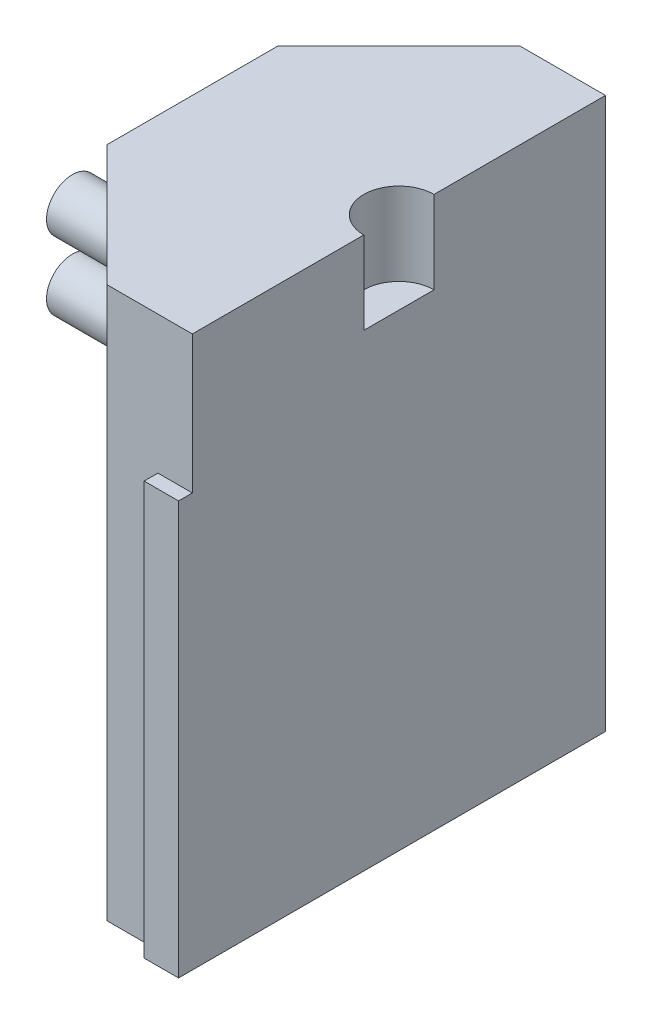
ISO-10303-21;
HEADER;
FILE_DESCRIPTION(('STEP AP214'),'2;1');
FILE_NAME('part.step','',(''),(''),'','','');
FILE_SCHEMA(('AUTOMOTIVE_DESIGN { 1 0 10303 214 1 1 1 1 }'));
ENDSEC;
DATA;
#1=APPLICATION_CONTEXT('core data for automotive mechanical design processes');
#2=APPLICATION_PROTOCOL_DEFINITION('international standard','automotive_design',2000,#1);
#3=PRODUCT_CONTEXT('',#1,'mechanical');
#4=PRODUCT('Part','Part','',(#3));
#5=PRODUCT_RELATED_PRODUCT_CATEGORY('part','',(#4));
#6=PRODUCT_DEFINITION_FORMATION('','',#4);
#7=PRODUCT_DEFINITION_CONTEXT('part definition',#1,'design');
#8=PRODUCT_DEFINITION('design','',#6,#7);
#9=PRODUCT_DEFINITION_SHAPE('','',#8);
#10=(LENGTH_UNIT() NAMED_UNIT(*) SI_UNIT(.MILLI.,.METRE.));
#11=(NAMED_UNIT(*) PLANE_ANGLE_UNIT() SI_UNIT($,.RADIAN.));
#12=(NAMED_UNIT(*) SI_UNIT($,.STERADIAN.) SOLID_ANGLE_UNIT());
#13=UNCERTAINTY_MEASURE_WITH_UNIT(LENGTH_MEASURE(1.E-05),#10,'distance_accuracy_value','');
#14=(GEOMETRIC_REPRESENTATION_CONTEXT(3) GLOBAL_UNCERTAINTY_ASSIGNED_CONTEXT((#13)) GLOBAL_UNIT_ASSIGNED_CONTEXT((#10,
#11,#12)) REPRESENTATION_CONTEXT('',''));
#15=CARTESIAN_POINT('',(0.,0.,0.));
#16=DIRECTION('',(0.,0.,1.));
#17=DIRECTION('',(1.,0.,0.));
#18=AXIS2_PLACEMENT_3D('',#15,#16,#17);
#19=CARTESIAN_POINT('',(-12.4264068711929,80.,30.));
#20=DIRECTION('',(0.,0.,-1.));
#21=DIRECTION('',(-1.,0.,0.));
#22=AXIS2_PLACEMENT_3D('',#19,#20,#21);
#23=PLANE('',#22);
#24=DIRECTION('',(0.,-1.,0.));
#25=VECTOR('',#24,1.);
#26=CARTESIAN_POINT('',(-4.99999999999999,0.,30.));
#27=LINE('',#26,#25);
#28=CARTESIAN_POINT('',(-4.99999999999999,60.,30.));
#29=VERTEX_POINT('',#28);
#30=CARTESIAN_POINT('',(-4.99999999999999,0.,30.));
#31=VERTEX_POINT('',#30);
#32=EDGE_CURVE('E423',#29,#31,#27,.T.);
#33=ORIENTED_EDGE('',*,*,#32,.F.);
#34=DIRECTION('',(-1.,0.,0.));
#35=VECTOR('',#34,1.);
#36=CARTESIAN_POINT('',(0.,60.,30.));
#37=LINE('',#36,#35);
#38=CARTESIAN_POINT('',(0.,60.,30.));
#39=VERTEX_POINT('',#38);
#40=EDGE_CURVE('E62',#39,#29,#37,.T.);
#41=ORIENTED_EDGE('',*,*,#40,.F.);
#42=DIRECTION('',(0.,1.,0.));
#43=VECTOR('',#42,1.);
#44=CARTESIAN_POINT('',(0.,0.,30.));
#45=LINE('',#44,#43);
#46=CARTESIAN_POINT('',(0.,80.,30.));
#47=VERTEX_POINT('',#46);
#48=EDGE_CURVE('E338',#39,#47,#45,.T.);
#49=ORIENTED_EDGE('',*,*,#48,.T.);
#50=DIRECTION('',(1.,0.,0.));
#51=VECTOR('',#50,1.);
#52=CARTESIAN_POINT('',(-12.4264068711929,80.,30.));
#53=LINE('',#52,#51);
#54=CARTESIAN_POINT('',(-12.4264068711929,80.,30.));
#55=VERTEX_POINT('',#54);
#56=EDGE_CURVE('E236',#55,#47,#53,.T.);
#57=ORIENTED_EDGE('',*,*,#56,.F.);
#58=DIRECTION('',(0.,-1.,0.));
#59=VECTOR('',#58,1.);
#60=CARTESIAN_POINT('',(-12.4264068711929,80.,30.));
#61=LINE('',#60,#59);
#62=CARTESIAN_POINT('',(-12.4264068711929,0.,30.));
#63=VERTEX_POINT('',#62);
#64=EDGE_CURVE('E233',#55,#63,#61,.T.);
#65=ORIENTED_EDGE('',*,*,#64,.T.);
#66=DIRECTION('',(1.,0.,0.));
#67=VECTOR('',#66,1.);
#68=CARTESIAN_POINT('',(-12.4264068711929,0.,30.));
#69=LINE('',#68,#67);
#70=EDGE_CURVE('E224',#63,#31,#69,.T.);
#71=ORIENTED_EDGE('',*,*,#70,.T.);
#72=EDGE_LOOP('',(#33,#41,#49,#57,#65,#71));
#73=FACE_BOUND('',#72,.T.);
#74=ADVANCED_FACE('F39',(#73),#23,.F.);
#75=CARTESIAN_POINT('',(-30.,80.,-12.4264068711928));
#76=DIRECTION('',(1.,0.,0.));
#77=DIRECTION('',(0.,0.,-1.));
#78=AXIS2_PLACEMENT_3D('',#75,#76,#77);
#79=PLANE('',#78);
#80=DIRECTION('',(0.,0.,-1.));
#81=VECTOR('',#80,1.);
#82=CARTESIAN_POINT('',(-30.,9.99999999999999,-12.4264068711928));
#83=LINE('',#82,#81);
#84=CARTESIAN_POINT('',(-30.,10.,5.));
#85=VERTEX_POINT('',#84);
#86=CARTESIAN_POINT('',(-30.,10.,-5.));
#87=VERTEX_POINT('',#86);
#88=EDGE_CURVE('E274',#85,#87,#83,.T.);
#89=ORIENTED_EDGE('',*,*,#88,.T.);
#90=DIRECTION('',(0.,1.,0.));
#91=VECTOR('',#90,1.);
#92=CARTESIAN_POINT('',(-30.,80.,-4.99999999999998));
#93=LINE('',#92,#91);
#94=CARTESIAN_POINT('',(-30.,20.,-5.));
#95=VERTEX_POINT('',#94);
#96=EDGE_CURVE('E212',#87,#95,#93,.T.);
#97=ORIENTED_EDGE('',*,*,#96,.T.);
#98=DIRECTION('',(0.,0.,1.));
#99=VECTOR('',#98,1.);
#100=CARTESIAN_POINT('',(-30.,20.,-12.4264068711928));
#101=LINE('',#100,#99);
#102=CARTESIAN_POINT('',(-30.,20.,5.));
#103=VERTEX_POINT('',#102);
#104=EDGE_CURVE('E280',#95,#103,#101,.T.);
#105=ORIENTED_EDGE('',*,*,#104,.T.);
#106=DIRECTION('',(0.,-1.,0.));
#107=VECTOR('',#106,1.);
#108=CARTESIAN_POINT('',(-30.,80.,5.00000000000001));
#109=LINE('',#108,#107);
#110=EDGE_CURVE('E277',#103,#85,#109,.T.);
#111=ORIENTED_EDGE('',*,*,#110,.T.);
#112=EDGE_LOOP('',(#89,#97,#105,#111));
#113=FACE_BOUND('',#112,.T.);
#114=DIRECTION('',(0.,-1.,0.));
#115=VECTOR('',#114,1.);
#116=CARTESIAN_POINT('',(-30.,80.,-12.4264068711928));
#117=LINE('',#116,#115);
#118=CARTESIAN_POINT('',(-30.,38.9,-12.4264068711928));
#119=VERTEX_POINT('',#118);
#120=CARTESIAN_POINT('',(-30.,5.1,-12.4264068711928));
#121=VERTEX_POINT('',#120);
#122=EDGE_CURVE('E240',#119,#121,#117,.T.);
#123=ORIENTED_EDGE('',*,*,#122,.T.);
#124=DIRECTION('',(0.,0.,1.));
#125=VECTOR('',#124,1.);
#126=CARTESIAN_POINT('',(-30.,5.1,-30.));
#127=LINE('',#126,#125);
#128=CARTESIAN_POINT('',(-30.,5.1,12.4264068711929));
#129=VERTEX_POINT('',#128);
#130=EDGE_CURVE('E219',#121,#129,#127,.T.);
#131=ORIENTED_EDGE('',*,*,#130,.T.);
#132=DIRECTION('',(0.,-1.,0.));
#133=VECTOR('',#132,1.);
#134=CARTESIAN_POINT('',(-30.,80.,12.4264068711929));
#135=LINE('',#134,#133);
#136=CARTESIAN_POINT('',(-30.,38.9,12.4264068711929));
#137=VERTEX_POINT('',#136);
#138=EDGE_CURVE('E235',#137,#129,#135,.T.);
#139=ORIENTED_EDGE('',*,*,#138,.F.);
#140=DIRECTION('',(0.,0.,1.));
#141=VECTOR('',#140,1.);
#142=CARTESIAN_POINT('',(-30.,38.9,-12.4264068711928));
#143=LINE('',#142,#141);
#144=EDGE_CURVE('E366',#119,#137,#143,.T.);
#145=ORIENTED_EDGE('',*,*,#144,.F.);
#146=EDGE_LOOP('',(#123,#131,#139,#145));
#147=FACE_BOUND('',#146,.T.);
#148=ADVANCED_FACE('F286',(#113,#147),#79,.F.);
#149=CARTESIAN_POINT('',(12.4264068711928,80.,-30.));
#150=DIRECTION('',(0.,0.,1.));
#151=DIRECTION('',(1.,0.,0.));
#152=AXIS2_PLACEMENT_3D('',#149,#150,#151);
#153=PLANE('',#152);
#154=DIRECTION('',(-1.,0.,0.));
#155=VECTOR('',#154,1.);
#156=CARTESIAN_POINT('',(12.4264068711928,80.,-30.));
#157=LINE('',#156,#155);
#158=CARTESIAN_POINT('',(0.,80.,-30.));
#159=VERTEX_POINT('',#158);
#160=CARTESIAN_POINT('',(-12.4264068711929,80.,-30.));
#161=VERTEX_POINT('',#160);
#162=EDGE_CURVE('E227',#159,#161,#157,.T.);
#163=ORIENTED_EDGE('',*,*,#162,.F.);
#164=DIRECTION('',(0.,1.,0.));
#165=VECTOR('',#164,1.);
#166=CARTESIAN_POINT('',(0.,0.,-30.));
#167=LINE('',#166,#165);
#168=CARTESIAN_POINT('',(0.,0.,-30.));
#169=VERTEX_POINT('',#168);
#170=EDGE_CURVE('E342',#169,#159,#167,.T.);
#171=ORIENTED_EDGE('',*,*,#170,.F.);
#172=DIRECTION('',(-1.,0.,0.));
#173=VECTOR('',#172,1.);
#174=CARTESIAN_POINT('',(12.4264068711928,0.,-30.));
#175=LINE('',#174,#173);
#176=CARTESIAN_POINT('',(-12.4264068711929,0.,-30.));
#177=VERTEX_POINT('',#176);
#178=EDGE_CURVE('E229',#169,#177,#175,.T.);
#179=ORIENTED_EDGE('',*,*,#178,.T.);
#180=DIRECTION('',(0.,-1.,0.));
#181=VECTOR('',#180,1.);
#182=CARTESIAN_POINT('',(-12.4264068711929,80.,-30.));
#183=LINE('',#182,#181);
#184=EDGE_CURVE('E246',#161,#177,#183,.T.);
#185=ORIENTED_EDGE('',*,*,#184,.F.);
#186=EDGE_LOOP('',(#163,#171,#179,#185));
#187=FACE_BOUND('',#186,.T.);
#188=ADVANCED_FACE('F41',(#187),#153,.F.);
#189=CARTESIAN_POINT('',(-12.4264068711929,80.,-30.));
#190=DIRECTION('',(0.707106781186548,0.,0.707106781186547));
#191=DIRECTION('',(0.707106781186547,0.,-0.707106781186548));
#192=AXIS2_PLACEMENT_3D('',#189,#190,#191);
#193=PLANE('',#192);
#194=DIRECTION('',(0.,1.,0.));
#195=VECTOR('',#194,1.);
#196=CARTESIAN_POINT('',(-24.9,80.,-17.5264068711928));
#197=LINE('',#196,#195);
#198=CARTESIAN_POINT('',(-24.9,0.,-17.5264068711928));
#199=VERTEX_POINT('',#198);
#200=CARTESIAN_POINT('',(-24.9,5.1,-17.5264068711928));
#201=VERTEX_POINT('',#200);
#202=EDGE_CURVE('E54',#199,#201,#197,.T.);
#203=ORIENTED_EDGE('',*,*,#202,.T.);
#204=DIRECTION('',(-0.707106781186547,0.,0.707106781186548));
#205=VECTOR('',#204,1.);
#206=CARTESIAN_POINT('',(-12.4264068711929,5.09999999999999,-30.));
#207=LINE('',#206,#205);
#208=EDGE_CURVE('E424',#201,#121,#207,.T.);
#209=ORIENTED_EDGE('',*,*,#208,.T.);
#210=ORIENTED_EDGE('',*,*,#122,.F.);
#211=DIRECTION('',(-0.707106781186547,0.,0.707106781186548));
#212=VECTOR('',#211,1.);
#213=CARTESIAN_POINT('',(-12.4264068711929,38.9,-30.));
#214=LINE('',#213,#212);
#215=CARTESIAN_POINT('',(-26.4287015257672,38.9,-15.9977053454256));
#216=VERTEX_POINT('',#215);
#217=EDGE_CURVE('E368',#216,#119,#214,.T.);
#218=ORIENTED_EDGE('',*,*,#217,.F.);
#219=DIRECTION('',(0.,1.,0.));
#220=VECTOR('',#219,1.);
#221=CARTESIAN_POINT('',(-26.4287015257672,80.,-15.9977053454256));
#222=LINE('',#221,#220);
#223=CARTESIAN_POINT('',(-26.4287015257672,41.1,-15.9977053454256));
#224=VERTEX_POINT('',#223);
#225=EDGE_CURVE('E257',#216,#224,#222,.T.);
#226=ORIENTED_EDGE('',*,*,#225,.T.);
#227=DIRECTION('',(-0.707106781186547,0.,0.707106781186548));
#228=VECTOR('',#227,1.);
#229=CARTESIAN_POINT('',(-12.4264068711929,41.1,-30.));
#230=LINE('',#229,#228);
#231=CARTESIAN_POINT('',(-30.,41.1,-12.4264068711928));
#232=VERTEX_POINT('',#231);
#233=EDGE_CURVE('E373',#224,#232,#230,.T.);
#234=ORIENTED_EDGE('',*,*,#233,.T.);
#235=CARTESIAN_POINT('',(-30.,80.,-12.4264068711928));
#236=VERTEX_POINT('',#235);
#237=EDGE_CURVE('E243',#236,#232,#117,.T.);
#238=ORIENTED_EDGE('',*,*,#237,.F.);
#239=DIRECTION('',(-0.707106781186547,0.,0.707106781186548));
#240=VECTOR('',#239,1.);
#241=CARTESIAN_POINT('',(-12.4264068711929,80.,-30.));
#242=LINE('',#241,#240);
#243=EDGE_CURVE('E377',#161,#236,#242,.T.);
#244=ORIENTED_EDGE('',*,*,#243,.F.);
#245=ORIENTED_EDGE('',*,*,#184,.T.);
#246=DIRECTION('',(-0.707106781186547,0.,0.707106781186548));
#247=VECTOR('',#246,1.);
#248=CARTESIAN_POINT('',(-12.4264068711929,0.,-30.));
#249=LINE('',#248,#247);
#250=EDGE_CURVE('E225',#177,#199,#249,.T.);
#251=ORIENTED_EDGE('',*,*,#250,.T.);
#252=EDGE_LOOP('',(#203,#209,#210,#218,#226,#234,#238,#244,#245,#251));
#253=FACE_BOUND('',#252,.T.);
#254=ADVANCED_FACE('F391',(#253),#193,.F.);
#255=CARTESIAN_POINT('',(-30.,56.25,12.4264068711929));
#256=VERTEX_POINT('',#255);
#257=CARTESIAN_POINT('',(-30.,41.1,12.4264068711929));
#258=VERTEX_POINT('',#257);
#259=EDGE_CURVE('E242',#256,#258,#135,.T.);
#260=ORIENTED_EDGE('',*,*,#259,.F.);
#261=CARTESIAN_POINT('',(-30.,60.,12.4264068711929));
#262=DIRECTION('',(1.,0.,0.));
#263=DIRECTION('',(0.,0.,-1.));
#264=AXIS2_PLACEMENT_3D('',#261,#262,#263);
#265=CIRCLE('',#264,3.75);
#266=CARTESIAN_POINT('',(-30.,63.75,12.4264068711929));
#267=VERTEX_POINT('',#266);
#268=EDGE_CURVE('E322',#256,#267,#265,.T.);
#269=ORIENTED_EDGE('',*,*,#268,.T.);
#270=CARTESIAN_POINT('',(-30.,66.25,12.4264068711929));
#271=VERTEX_POINT('',#270);
#272=EDGE_CURVE('E241',#271,#267,#135,.T.);
#273=ORIENTED_EDGE('',*,*,#272,.F.);
#274=CARTESIAN_POINT('',(-30.,70.,12.4264068711929));
#275=DIRECTION('',(1.,0.,0.));
#276=DIRECTION('',(0.,0.,-1.));
#277=AXIS2_PLACEMENT_3D('',#274,#275,#276);
#278=CIRCLE('',#277,3.75);
#279=CARTESIAN_POINT('',(-30.,73.75,12.4264068711929));
#280=VERTEX_POINT('',#279);
#281=EDGE_CURVE('E328',#271,#280,#278,.T.);
#282=ORIENTED_EDGE('',*,*,#281,.T.);
#283=CARTESIAN_POINT('',(-30.,80.,12.4264068711929));
#284=VERTEX_POINT('',#283);
#285=EDGE_CURVE('E237',#284,#280,#135,.T.);
#286=ORIENTED_EDGE('',*,*,#285,.F.);
#287=DIRECTION('',(0.,0.,1.));
#288=VECTOR('',#287,1.);
#289=CARTESIAN_POINT('',(-30.,80.,-12.4264068711928));
#290=LINE('',#289,#288);
#291=EDGE_CURVE('E379',#236,#284,#290,.T.);
#292=ORIENTED_EDGE('',*,*,#291,.F.);
#293=ORIENTED_EDGE('',*,*,#237,.T.);
#294=DIRECTION('',(0.,0.,1.));
#295=VECTOR('',#294,1.);
#296=CARTESIAN_POINT('',(-30.,41.1,-12.4264068711928));
#297=LINE('',#296,#295);
#298=EDGE_CURVE('E370',#232,#258,#297,.T.);
#299=ORIENTED_EDGE('',*,*,#298,.T.);
#300=EDGE_LOOP('',(#260,#269,#273,#282,#286,#292,#293,#299));
#301=FACE_BOUND('',#300,.T.);
#302=ADVANCED_FACE('F457',(#301),#79,.F.);
#303=CARTESIAN_POINT('',(-30.,80.,12.4264068711929));
#304=DIRECTION('',(0.707106781186548,0.,-0.707106781186548));
#305=DIRECTION('',(-0.707106781186548,0.,-0.707106781186548));
#306=AXIS2_PLACEMENT_3D('',#303,#304,#305);
#307=PLANE('',#306);
#308=ORIENTED_EDGE('',*,*,#138,.T.);
#309=DIRECTION('',(0.707106781186548,0.,0.707106781186548));
#310=VECTOR('',#309,1.);
#311=CARTESIAN_POINT('',(-30.,5.09999999999999,12.4264068711929));
#312=LINE('',#311,#310);
#313=CARTESIAN_POINT('',(-24.9,5.1,17.5264068711929));
#314=VERTEX_POINT('',#313);
#315=EDGE_CURVE('E11',#129,#314,#312,.T.);
#316=ORIENTED_EDGE('',*,*,#315,.T.);
#317=DIRECTION('',(0.,-1.,0.));
#318=VECTOR('',#317,1.);
#319=CARTESIAN_POINT('',(-24.9,80.,17.5264068711929));
#320=LINE('',#319,#318);
#321=CARTESIAN_POINT('',(-24.9,0.,17.5264068711929));
#322=VERTEX_POINT('',#321);
#323=EDGE_CURVE('E206',#314,#322,#320,.T.);
#324=ORIENTED_EDGE('',*,*,#323,.T.);
#325=DIRECTION('',(0.707106781186548,0.,0.707106781186548));
#326=VECTOR('',#325,1.);
#327=CARTESIAN_POINT('',(-30.,0.,12.4264068711929));
#328=LINE('',#327,#326);
#329=EDGE_CURVE('E217',#322,#63,#328,.T.);
#330=ORIENTED_EDGE('',*,*,#329,.T.);
#331=ORIENTED_EDGE('',*,*,#64,.F.);
#332=DIRECTION('',(0.707106781186548,0.,0.707106781186548));
#333=VECTOR('',#332,1.);
#334=CARTESIAN_POINT('',(-30.,80.,12.4264068711929));
#335=LINE('',#334,#333);
#336=EDGE_CURVE('E381',#284,#55,#335,.T.);
#337=ORIENTED_EDGE('',*,*,#336,.F.);
#338=ORIENTED_EDGE('',*,*,#285,.T.);
#339=CARTESIAN_POINT('',(-30.,70.,12.4264068711929));
#340=DIRECTION('',(0.707106781186548,0.,-0.707106781186548));
#341=DIRECTION('',(-0.707106781186548,0.,-0.707106781186548));
#342=AXIS2_PLACEMENT_3D('',#339,#340,#341);
#343=ELLIPSE('',#342,5.3033008588991,3.75);
#344=EDGE_CURVE('E268',#280,#271,#343,.T.);
#345=ORIENTED_EDGE('',*,*,#344,.T.);
#346=ORIENTED_EDGE('',*,*,#272,.T.);
#347=CARTESIAN_POINT('',(-30.,60.,12.4264068711929));
#348=DIRECTION('',(0.707106781186548,0.,-0.707106781186548));
#349=DIRECTION('',(-0.707106781186548,0.,-0.707106781186548));
#350=AXIS2_PLACEMENT_3D('',#347,#348,#349);
#351=ELLIPSE('',#350,5.3033008588991,3.75);
#352=EDGE_CURVE('E271',#267,#256,#351,.T.);
#353=ORIENTED_EDGE('',*,*,#352,.T.);
#354=ORIENTED_EDGE('',*,*,#259,.T.);
#355=DIRECTION('',(0.707106781186548,0.,0.707106781186548));
#356=VECTOR('',#355,1.);
#357=CARTESIAN_POINT('',(-30.,41.1,12.4264068711929));
#358=LINE('',#357,#356);
#359=CARTESIAN_POINT('',(-26.4287015257672,41.1,15.9977053454256));
#360=VERTEX_POINT('',#359);
#361=EDGE_CURVE('E254',#258,#360,#358,.T.);
#362=ORIENTED_EDGE('',*,*,#361,.T.);
#363=DIRECTION('',(0.,-1.,0.));
#364=VECTOR('',#363,1.);
#365=CARTESIAN_POINT('',(-26.4287015257673,80.,15.9977053454256));
#366=LINE('',#365,#364);
#367=CARTESIAN_POINT('',(-26.4287015257672,38.9,15.9977053454256));
#368=VERTEX_POINT('',#367);
#369=EDGE_CURVE('E251',#360,#368,#366,.T.);
#370=ORIENTED_EDGE('',*,*,#369,.T.);
#371=DIRECTION('',(0.707106781186548,0.,0.707106781186548));
#372=VECTOR('',#371,1.);
#373=CARTESIAN_POINT('',(-30.,38.9,12.4264068711929));
#374=LINE('',#373,#372);
#375=EDGE_CURVE('E249',#137,#368,#374,.T.);
#376=ORIENTED_EDGE('',*,*,#375,.F.);
#377=EDGE_LOOP('',(#308,#316,#324,#330,#331,#337,#338,#345,#346,#353,#354,#362,#370,#376));
#378=FACE_BOUND('',#377,.T.);
#379=ADVANCED_FACE('F215',(#378),#307,.F.);
#380=CARTESIAN_POINT('',(0.,80.,0.));
#381=DIRECTION('',(0.,1.,0.));
#382=DIRECTION('',(0.,0.,1.));
#383=AXIS2_PLACEMENT_3D('',#380,#381,#382);
#384=PLANE('',#383);
#385=CARTESIAN_POINT('',(0.,80.,0.));
#386=DIRECTION('',(0.,1.,0.));
#387=DIRECTION('',(0.,0.,1.));
#388=AXIS2_PLACEMENT_3D('',#385,#386,#387);
#389=CIRCLE('',#388,5.1);
#390=CARTESIAN_POINT('',(0.,80.,-5.1));
#391=VERTEX_POINT('',#390);
#392=CARTESIAN_POINT('',(0.,80.,5.1));
#393=VERTEX_POINT('',#392);
#394=EDGE_CURVE('E331',#391,#393,#389,.T.);
#395=ORIENTED_EDGE('',*,*,#394,.F.);
#396=DIRECTION('',(0.,0.,1.));
#397=VECTOR('',#396,1.);
#398=CARTESIAN_POINT('',(0.,80.,-30.));
#399=LINE('',#398,#397);
#400=EDGE_CURVE('E339',#159,#391,#399,.T.);
#401=ORIENTED_EDGE('',*,*,#400,.F.);
#402=ORIENTED_EDGE('',*,*,#162,.T.);
#403=ORIENTED_EDGE('',*,*,#243,.T.);
#404=ORIENTED_EDGE('',*,*,#291,.T.);
#405=ORIENTED_EDGE('',*,*,#336,.T.);
#406=ORIENTED_EDGE('',*,*,#56,.T.);
#407=EDGE_CURVE('E334',#393,#47,#399,.T.);
#408=ORIENTED_EDGE('',*,*,#407,.F.);
#409=EDGE_LOOP('',(#395,#401,#402,#403,#404,#405,#406,#408));
#410=FACE_BOUND('',#409,.T.);
#411=ADVANCED_FACE('F396',(#410),#384,.T.);
#412=CARTESIAN_POINT('',(0.,0.,0.));
#413=DIRECTION('',(0.,1.,0.));
#414=DIRECTION('',(0.,0.,1.));
#415=AXIS2_PLACEMENT_3D('',#412,#413,#414);
#416=PLANE('',#415);
#417=ORIENTED_EDGE('',*,*,#329,.F.);
#418=DIRECTION('',(0.,0.,-1.));
#419=VECTOR('',#418,1.);
#420=CARTESIAN_POINT('',(-24.9,0.,0.));
#421=LINE('',#420,#419);
#422=EDGE_CURVE('E47',#322,#199,#421,.T.);
#423=ORIENTED_EDGE('',*,*,#422,.T.);
#424=ORIENTED_EDGE('',*,*,#250,.F.);
#425=ORIENTED_EDGE('',*,*,#178,.F.);
#426=DIRECTION('',(0.,0.,1.));
#427=VECTOR('',#426,1.);
#428=CARTESIAN_POINT('',(0.,0.,-30.));
#429=LINE('',#428,#427);
#430=CARTESIAN_POINT('',(0.,0.,32.));
#431=VERTEX_POINT('',#430);
#432=EDGE_CURVE('E336',#169,#431,#429,.T.);
#433=ORIENTED_EDGE('',*,*,#432,.T.);
#434=DIRECTION('',(1.,0.,0.));
#435=VECTOR('',#434,1.);
#436=CARTESIAN_POINT('',(0.,0.,32.));
#437=LINE('',#436,#435);
#438=CARTESIAN_POINT('',(-4.99999999999999,0.,32.));
#439=VERTEX_POINT('',#438);
#440=EDGE_CURVE('E409',#439,#431,#437,.T.);
#441=ORIENTED_EDGE('',*,*,#440,.F.);
#442=DIRECTION('',(0.,0.,-1.));
#443=VECTOR('',#442,1.);
#444=CARTESIAN_POINT('',(-4.99999999999999,0.,32.));
#445=LINE('',#444,#443);
#446=EDGE_CURVE('E415',#439,#31,#445,.T.);
#447=ORIENTED_EDGE('',*,*,#446,.T.);
#448=ORIENTED_EDGE('',*,*,#70,.F.);
#449=EDGE_LOOP('',(#417,#423,#424,#425,#433,#441,#447,#448));
#450=FACE_BOUND('',#449,.T.);
#451=ADVANCED_FACE('F222',(#450),#416,.F.);
#452=CARTESIAN_POINT('',(-40.,41.1,-25.));
#453=DIRECTION('',(0.552775645159804,0.,-0.833330118331363));
#454=DIRECTION('',(-0.833330118331363,0.,-0.552775645159804));
#455=AXIS2_PLACEMENT_3D('',#452,#453,#454);
#456=PLANE('',#455);
#457=DIRECTION('',(0.833330118331363,0.,0.552775645159804));
#458=VECTOR('',#457,1.);
#459=CARTESIAN_POINT('',(-40.,38.9,-25.));
#460=LINE('',#459,#458);
#461=CARTESIAN_POINT('',(-10.,38.9,-5.1));
#462=VERTEX_POINT('',#461);
#463=EDGE_CURVE('E351',#216,#462,#460,.T.);
#464=ORIENTED_EDGE('',*,*,#463,.T.);
#465=DIRECTION('',(0.,-1.,0.));
#466=VECTOR('',#465,1.);
#467=CARTESIAN_POINT('',(-10.,41.1,-5.1));
#468=LINE('',#467,#466);
#469=CARTESIAN_POINT('',(-10.,41.1,-5.1));
#470=VERTEX_POINT('',#469);
#471=EDGE_CURVE('E361',#470,#462,#468,.T.);
#472=ORIENTED_EDGE('',*,*,#471,.F.);
#473=DIRECTION('',(0.833330118331363,0.,0.552775645159804));
#474=VECTOR('',#473,1.);
#475=CARTESIAN_POINT('',(-40.,41.1,-25.));
#476=LINE('',#475,#474);
#477=EDGE_CURVE('E359',#224,#470,#476,.T.);
#478=ORIENTED_EDGE('',*,*,#477,.F.);
#479=ORIENTED_EDGE('',*,*,#225,.F.);
#480=EDGE_LOOP('',(#464,#472,#478,#479));
#481=FACE_BOUND('',#480,.T.);
#482=ADVANCED_FACE('F586',(#481),#456,.F.);
#483=CARTESIAN_POINT('',(-10.,41.1,5.1));
#484=DIRECTION('',(0.552775645159804,0.,0.833330118331363));
#485=DIRECTION('',(0.833330118331363,0.,-0.552775645159804));
#486=AXIS2_PLACEMENT_3D('',#483,#484,#485);
#487=PLANE('',#486);
#488=DIRECTION('',(-0.833330118331363,0.,0.552775645159804));
#489=VECTOR('',#488,1.);
#490=CARTESIAN_POINT('',(-10.,41.1,5.1));
#491=LINE('',#490,#489);
#492=CARTESIAN_POINT('',(-10.,41.1,5.1));
#493=VERTEX_POINT('',#492);
#494=EDGE_CURVE('E353',#493,#360,#491,.T.);
#495=ORIENTED_EDGE('',*,*,#494,.F.);
#496=DIRECTION('',(0.,-1.,0.));
#497=VECTOR('',#496,1.);
#498=CARTESIAN_POINT('',(-10.,41.1,5.1));
#499=LINE('',#498,#497);
#500=CARTESIAN_POINT('',(-10.,38.9,5.1));
#501=VERTEX_POINT('',#500);
#502=EDGE_CURVE('E364',#493,#501,#499,.T.);
#503=ORIENTED_EDGE('',*,*,#502,.T.);
#504=DIRECTION('',(-0.833330118331363,0.,0.552775645159804));
#505=VECTOR('',#504,1.);
#506=CARTESIAN_POINT('',(-10.,38.9,5.1));
#507=LINE('',#506,#505);
#508=EDGE_CURVE('E344',#501,#368,#507,.T.);
#509=ORIENTED_EDGE('',*,*,#508,.T.);
#510=ORIENTED_EDGE('',*,*,#369,.F.);
#511=EDGE_LOOP('',(#495,#503,#509,#510));
#512=FACE_BOUND('',#511,.T.);
#513=ADVANCED_FACE('F683',(#512),#487,.F.);
#514=CARTESIAN_POINT('',(0.,41.1,0.));
#515=DIRECTION('',(0.,1.,0.));
#516=DIRECTION('',(0.,0.,1.));
#517=AXIS2_PLACEMENT_3D('',#514,#515,#516);
#518=PLANE('',#517);
#519=ORIENTED_EDGE('',*,*,#477,.T.);
#520=DIRECTION('',(0.,0.,1.));
#521=VECTOR('',#520,1.);
#522=CARTESIAN_POINT('',(-10.,41.1,-5.1));
#523=LINE('',#522,#521);
#524=EDGE_CURVE('E356',#470,#493,#523,.T.);
#525=ORIENTED_EDGE('',*,*,#524,.T.);
#526=ORIENTED_EDGE('',*,*,#494,.T.);
#527=ORIENTED_EDGE('',*,*,#361,.F.);
#528=ORIENTED_EDGE('',*,*,#298,.F.);
#529=ORIENTED_EDGE('',*,*,#233,.F.);
#530=EDGE_LOOP('',(#519,#525,#526,#527,#528,#529));
#531=FACE_BOUND('',#530,.T.);
#532=ADVANCED_FACE('F679',(#531),#518,.F.);
#533=CARTESIAN_POINT('',(0.,38.9,0.));
#534=DIRECTION('',(0.,1.,0.));
#535=DIRECTION('',(0.,0.,1.));
#536=AXIS2_PLACEMENT_3D('',#533,#534,#535);
#537=PLANE('',#536);
#538=ORIENTED_EDGE('',*,*,#217,.T.);
#539=ORIENTED_EDGE('',*,*,#144,.T.);
#540=ORIENTED_EDGE('',*,*,#375,.T.);
#541=ORIENTED_EDGE('',*,*,#508,.F.);
#542=DIRECTION('',(0.,0.,1.));
#543=VECTOR('',#542,1.);
#544=CARTESIAN_POINT('',(-10.,38.9,-5.1));
#545=LINE('',#544,#543);
#546=EDGE_CURVE('E348',#462,#501,#545,.T.);
#547=ORIENTED_EDGE('',*,*,#546,.F.);
#548=ORIENTED_EDGE('',*,*,#463,.F.);
#549=EDGE_LOOP('',(#538,#539,#540,#541,#547,#548));
#550=FACE_BOUND('',#549,.T.);
#551=ADVANCED_FACE('F669',(#550),#537,.T.);
#552=CARTESIAN_POINT('',(-10.,41.1,-5.1));
#553=DIRECTION('',(1.,0.,0.));
#554=DIRECTION('',(0.,0.,-1.));
#555=AXIS2_PLACEMENT_3D('',#552,#553,#554);
#556=PLANE('',#555);
#557=ORIENTED_EDGE('',*,*,#502,.F.);
#558=ORIENTED_EDGE('',*,*,#524,.F.);
#559=ORIENTED_EDGE('',*,*,#471,.T.);
#560=ORIENTED_EDGE('',*,*,#546,.T.);
#561=EDGE_LOOP('',(#557,#558,#559,#560));
#562=FACE_BOUND('',#561,.T.);
#563=ADVANCED_FACE('F475',(#562),#556,.F.);
#564=CARTESIAN_POINT('',(0.,0.,-30.));
#565=DIRECTION('',(-1.,0.,0.));
#566=DIRECTION('',(0.,0.,1.));
#567=AXIS2_PLACEMENT_3D('',#564,#565,#566);
#568=PLANE('',#567);
#569=DIRECTION('',(0.,0.,-1.));
#570=VECTOR('',#569,1.);
#571=CARTESIAN_POINT('',(0.,68.,-30.));
#572=LINE('',#571,#570);
#573=CARTESIAN_POINT('',(0.,68.,5.1));
#574=VERTEX_POINT('',#573);
#575=CARTESIAN_POINT('',(0.,68.,-5.1));
#576=VERTEX_POINT('',#575);
#577=EDGE_CURVE('E260',#574,#576,#572,.T.);
#578=ORIENTED_EDGE('',*,*,#577,.F.);
#579=DIRECTION('',(0.,1.,0.));
#580=VECTOR('',#579,1.);
#581=CARTESIAN_POINT('',(0.,68.,5.1));
#582=LINE('',#581,#580);
#583=EDGE_CURVE('E265',#574,#393,#582,.T.);
#584=ORIENTED_EDGE('',*,*,#583,.T.);
#585=ORIENTED_EDGE('',*,*,#407,.T.);
#586=ORIENTED_EDGE('',*,*,#48,.F.);
#587=DIRECTION('',(0.,0.,-1.));
#588=VECTOR('',#587,1.);
#589=CARTESIAN_POINT('',(0.,60.,32.));
#590=LINE('',#589,#588);
#591=CARTESIAN_POINT('',(0.,60.,32.));
#592=VERTEX_POINT('',#591);
#593=EDGE_CURVE('E301',#592,#39,#590,.T.);
#594=ORIENTED_EDGE('',*,*,#593,.F.);
#595=DIRECTION('',(0.,1.,0.));
#596=VECTOR('',#595,1.);
#597=CARTESIAN_POINT('',(0.,0.,32.));
#598=LINE('',#597,#596);
#599=EDGE_CURVE('E406',#431,#592,#598,.T.);
#600=ORIENTED_EDGE('',*,*,#599,.F.);
#601=ORIENTED_EDGE('',*,*,#432,.F.);
#602=ORIENTED_EDGE('',*,*,#170,.T.);
#603=ORIENTED_EDGE('',*,*,#400,.T.);
#604=DIRECTION('',(0.,1.,0.));
#605=VECTOR('',#604,1.);
#606=CARTESIAN_POINT('',(0.,68.,-5.1));
#607=LINE('',#606,#605);
#608=EDGE_CURVE('E262',#391,#576,#607,.F.);
#609=ORIENTED_EDGE('',*,*,#608,.T.);
#610=EDGE_LOOP('',(#578,#584,#585,#586,#594,#600,#601,#602,#603,#609));
#611=FACE_BOUND('',#610,.T.);
#612=ADVANCED_FACE('F402',(#611),#568,.F.);
#613=CARTESIAN_POINT('',(0.,68.,0.));
#614=DIRECTION('',(0.,1.,0.));
#615=DIRECTION('',(0.,0.,1.));
#616=AXIS2_PLACEMENT_3D('',#613,#614,#615);
#617=CYLINDRICAL_SURFACE('',#616,5.1);
#618=CARTESIAN_POINT('',(0.,68.,0.));
#619=DIRECTION('',(0.,1.,0.));
#620=DIRECTION('',(0.,0.,1.));
#621=AXIS2_PLACEMENT_3D('',#618,#619,#620);
#622=CIRCLE('',#621,5.1);
#623=EDGE_CURVE('E332',#576,#574,#622,.T.);
#624=ORIENTED_EDGE('',*,*,#623,.F.);
#625=ORIENTED_EDGE('',*,*,#608,.F.);
#626=ORIENTED_EDGE('',*,*,#394,.T.);
#627=ORIENTED_EDGE('',*,*,#583,.F.);
#628=EDGE_LOOP('',(#624,#625,#626,#627));
#629=FACE_BOUND('',#628,.T.);
#630=ADVANCED_FACE('F487',(#629),#617,.F.);
#631=CARTESIAN_POINT('',(0.,68.,0.));
#632=DIRECTION('',(0.,1.,0.));
#633=DIRECTION('',(0.,0.,1.));
#634=AXIS2_PLACEMENT_3D('',#631,#632,#633);
#635=PLANE('',#634);
#636=ORIENTED_EDGE('',*,*,#577,.T.);
#637=ORIENTED_EDGE('',*,*,#623,.T.);
#638=EDGE_LOOP('',(#636,#637));
#639=FACE_BOUND('',#638,.T.);
#640=ADVANCED_FACE('F491',(#639),#635,.T.);
#641=CARTESIAN_POINT('',(-18.,70.,12.4264068711929));
#642=DIRECTION('',(-1.,0.,0.));
#643=DIRECTION('',(0.,0.,1.));
#644=AXIS2_PLACEMENT_3D('',#641,#642,#643);
#645=CYLINDRICAL_SURFACE('',#644,3.75);
#646=CARTESIAN_POINT('',(-35.,70.,12.4264068711929));
#647=DIRECTION('',(-1.,0.,0.));
#648=DIRECTION('',(0.,0.,1.));
#649=AXIS2_PLACEMENT_3D('',#646,#647,#648);
#650=CIRCLE('',#649,3.75);
#651=CARTESIAN_POINT('',(-35.,70.,16.1764068711929));
#652=VERTEX_POINT('',#651);
#653=EDGE_CURVE('E325',#652,#652,#650,.T.);
#654=ORIENTED_EDGE('',*,*,#653,.F.);
#655=EDGE_LOOP('',(#654));
#656=FACE_BOUND('',#655,.T.);
#657=ORIENTED_EDGE('',*,*,#281,.F.);
#658=ORIENTED_EDGE('',*,*,#344,.F.);
#659=EDGE_LOOP('',(#657,#658));
#660=FACE_BOUND('',#659,.T.);
#661=ADVANCED_FACE('F500',(#656,#660),#645,.T.);
#662=CARTESIAN_POINT('',(-35.,70.,12.4264068711929));
#663=DIRECTION('',(-1.,0.,0.));
#664=DIRECTION('',(0.,0.,1.));
#665=AXIS2_PLACEMENT_3D('',#662,#663,#664);
#666=PLANE('',#665);
#667=ORIENTED_EDGE('',*,*,#653,.T.);
#668=EDGE_LOOP('',(#667));
#669=FACE_BOUND('',#668,.T.);
#670=ADVANCED_FACE('F515',(#669),#666,.T.);
#671=CARTESIAN_POINT('',(-18.,60.,12.4264068711929));
#672=DIRECTION('',(-1.,0.,0.));
#673=DIRECTION('',(0.,0.,1.));
#674=AXIS2_PLACEMENT_3D('',#671,#672,#673);
#675=CYLINDRICAL_SURFACE('',#674,3.75);
#676=CARTESIAN_POINT('',(-35.,60.,12.4264068711929));
#677=DIRECTION('',(-1.,0.,0.));
#678=DIRECTION('',(0.,0.,1.));
#679=AXIS2_PLACEMENT_3D('',#676,#677,#678);
#680=CIRCLE('',#679,3.75);
#681=CARTESIAN_POINT('',(-35.,60.,16.1764068711929));
#682=VERTEX_POINT('',#681);
#683=EDGE_CURVE('E319',#682,#682,#680,.T.);
#684=ORIENTED_EDGE('',*,*,#683,.F.);
#685=EDGE_LOOP('',(#684));
#686=FACE_BOUND('',#685,.T.);
#687=ORIENTED_EDGE('',*,*,#268,.F.);
#688=ORIENTED_EDGE('',*,*,#352,.F.);
#689=EDGE_LOOP('',(#687,#688));
#690=FACE_BOUND('',#689,.T.);
#691=ADVANCED_FACE('F524',(#686,#690),#675,.T.);
#692=CARTESIAN_POINT('',(-35.,60.,12.4264068711929));
#693=DIRECTION('',(-1.,0.,0.));
#694=DIRECTION('',(0.,0.,1.));
#695=AXIS2_PLACEMENT_3D('',#692,#693,#694);
#696=PLANE('',#695);
#697=ORIENTED_EDGE('',*,*,#683,.T.);
#698=EDGE_LOOP('',(#697));
#699=FACE_BOUND('',#698,.T.);
#700=ADVANCED_FACE('F446',(#699),#696,.T.);
#701=CARTESIAN_POINT('',(-18.,20.,-5.));
#702=DIRECTION('',(0.,0.,-1.));
#703=DIRECTION('',(0.,1.,0.));
#704=AXIS2_PLACEMENT_3D('',#701,#702,#703);
#705=PLANE('',#704);
#706=ORIENTED_EDGE('',*,*,#96,.F.);
#707=DIRECTION('',(-1.,0.,0.));
#708=VECTOR('',#707,1.);
#709=CARTESIAN_POINT('',(-18.,10.,-5.));
#710=LINE('',#709,#708);
#711=CARTESIAN_POINT('',(-35.,10.,-5.));
#712=VERTEX_POINT('',#711);
#713=EDGE_CURVE('E292',#87,#712,#710,.T.);
#714=ORIENTED_EDGE('',*,*,#713,.T.);
#715=DIRECTION('',(0.,-1.,0.));
#716=VECTOR('',#715,1.);
#717=CARTESIAN_POINT('',(-35.,20.,-5.));
#718=LINE('',#717,#716);
#719=CARTESIAN_POINT('',(-35.,20.,-5.));
#720=VERTEX_POINT('',#719);
#721=EDGE_CURVE('E296',#720,#712,#718,.T.);
#722=ORIENTED_EDGE('',*,*,#721,.F.);
#723=DIRECTION('',(-1.,0.,0.));
#724=VECTOR('',#723,1.);
#725=CARTESIAN_POINT('',(-18.,20.,-5.));
#726=LINE('',#725,#724);
#727=EDGE_CURVE('E294',#95,#720,#726,.T.);
#728=ORIENTED_EDGE('',*,*,#727,.F.);
#729=EDGE_LOOP('',(#706,#714,#722,#728));
#730=FACE_BOUND('',#729,.T.);
#731=ADVANCED_FACE('F290',(#730),#705,.T.);
#732=CARTESIAN_POINT('',(-18.,20.,-5.));
#733=DIRECTION('',(0.,1.,0.));
#734=DIRECTION('',(0.,0.,1.));
#735=AXIS2_PLACEMENT_3D('',#732,#733,#734);
#736=PLANE('',#735);
#737=ORIENTED_EDGE('',*,*,#104,.F.);
#738=ORIENTED_EDGE('',*,*,#727,.T.);
#739=DIRECTION('',(0.,0.,-1.));
#740=VECTOR('',#739,1.);
#741=CARTESIAN_POINT('',(-35.,20.,-5.));
#742=LINE('',#741,#740);
#743=CARTESIAN_POINT('',(-35.,20.,5.));
#744=VERTEX_POINT('',#743);
#745=EDGE_CURVE('E310',#744,#720,#742,.T.);
#746=ORIENTED_EDGE('',*,*,#745,.F.);
#747=DIRECTION('',(-1.,0.,0.));
#748=VECTOR('',#747,1.);
#749=CARTESIAN_POINT('',(-18.,20.,5.));
#750=LINE('',#749,#748);
#751=EDGE_CURVE('E300',#103,#744,#750,.T.);
#752=ORIENTED_EDGE('',*,*,#751,.F.);
#753=EDGE_LOOP('',(#737,#738,#746,#752));
#754=FACE_BOUND('',#753,.T.);
#755=ADVANCED_FACE('F438',(#754),#736,.T.);
#756=CARTESIAN_POINT('',(-18.,20.,5.));
#757=DIRECTION('',(0.,0.,1.));
#758=DIRECTION('',(0.,-1.,0.));
#759=AXIS2_PLACEMENT_3D('',#756,#757,#758);
#760=PLANE('',#759);
#761=ORIENTED_EDGE('',*,*,#110,.F.);
#762=ORIENTED_EDGE('',*,*,#751,.T.);
#763=DIRECTION('',(0.,1.,0.));
#764=VECTOR('',#763,1.);
#765=CARTESIAN_POINT('',(-35.,20.,5.));
#766=LINE('',#765,#764);
#767=CARTESIAN_POINT('',(-35.,10.,5.));
#768=VERTEX_POINT('',#767);
#769=EDGE_CURVE('E312',#768,#744,#766,.T.);
#770=ORIENTED_EDGE('',*,*,#769,.F.);
#771=DIRECTION('',(-1.,0.,0.));
#772=VECTOR('',#771,1.);
#773=CARTESIAN_POINT('',(-18.,10.,5.));
#774=LINE('',#773,#772);
#775=EDGE_CURVE('E303',#85,#768,#774,.T.);
#776=ORIENTED_EDGE('',*,*,#775,.F.);
#777=EDGE_LOOP('',(#761,#762,#770,#776));
#778=FACE_BOUND('',#777,.T.);
#779=ADVANCED_FACE('F436',(#778),#760,.T.);
#780=CARTESIAN_POINT('',(-18.,10.,-5.));
#781=DIRECTION('',(0.,-1.,0.));
#782=DIRECTION('',(0.,0.,-1.));
#783=AXIS2_PLACEMENT_3D('',#780,#781,#782);
#784=PLANE('',#783);
#785=ORIENTED_EDGE('',*,*,#88,.F.);
#786=ORIENTED_EDGE('',*,*,#775,.T.);
#787=DIRECTION('',(0.,0.,1.));
#788=VECTOR('',#787,1.);
#789=CARTESIAN_POINT('',(-35.,10.,-5.));
#790=LINE('',#789,#788);
#791=EDGE_CURVE('E315',#712,#768,#790,.T.);
#792=ORIENTED_EDGE('',*,*,#791,.F.);
#793=ORIENTED_EDGE('',*,*,#713,.F.);
#794=EDGE_LOOP('',(#785,#786,#792,#793));
#795=FACE_BOUND('',#794,.T.);
#796=ADVANCED_FACE('F431',(#795),#784,.T.);
#797=CARTESIAN_POINT('',(-35.,0.,0.));
#798=DIRECTION('',(-1.,0.,0.));
#799=DIRECTION('',(0.,0.,1.));
#800=AXIS2_PLACEMENT_3D('',#797,#798,#799);
#801=PLANE('',#800);
#802=ORIENTED_EDGE('',*,*,#721,.T.);
#803=ORIENTED_EDGE('',*,*,#791,.T.);
#804=ORIENTED_EDGE('',*,*,#769,.T.);
#805=ORIENTED_EDGE('',*,*,#745,.T.);
#806=EDGE_LOOP('',(#802,#803,#804,#805));
#807=FACE_BOUND('',#806,.T.);
#808=ADVANCED_FACE('F435',(#807),#801,.T.);
#809=CARTESIAN_POINT('',(0.,60.,32.));
#810=DIRECTION('',(0.,-1.,0.));
#811=DIRECTION('',(0.,0.,-1.));
#812=AXIS2_PLACEMENT_3D('',#809,#810,#811);
#813=PLANE('',#812);
#814=ORIENTED_EDGE('',*,*,#40,.T.);
#815=DIRECTION('',(0.,0.,-1.));
#816=VECTOR('',#815,1.);
#817=CARTESIAN_POINT('',(-4.99999999999999,60.,32.));
#818=LINE('',#817,#816);
#819=CARTESIAN_POINT('',(-4.99999999999999,60.,32.));
#820=VERTEX_POINT('',#819);
#821=EDGE_CURVE('E306',#820,#29,#818,.T.);
#822=ORIENTED_EDGE('',*,*,#821,.F.);
#823=DIRECTION('',(-1.,0.,0.));
#824=VECTOR('',#823,1.);
#825=CARTESIAN_POINT('',(0.,60.,32.));
#826=LINE('',#825,#824);
#827=EDGE_CURVE('E418',#592,#820,#826,.T.);
#828=ORIENTED_EDGE('',*,*,#827,.F.);
#829=ORIENTED_EDGE('',*,*,#593,.T.);
#830=EDGE_LOOP('',(#814,#822,#828,#829));
#831=FACE_BOUND('',#830,.T.);
#832=ADVANCED_FACE('F574',(#831),#813,.F.);
#833=CARTESIAN_POINT('',(-4.99999999999999,0.,32.));
#834=DIRECTION('',(1.,0.,0.));
#835=DIRECTION('',(0.,1.,0.));
#836=AXIS2_PLACEMENT_3D('',#833,#834,#835);
#837=PLANE('',#836);
#838=ORIENTED_EDGE('',*,*,#32,.T.);
#839=ORIENTED_EDGE('',*,*,#446,.F.);
#840=DIRECTION('',(0.,-1.,0.));
#841=VECTOR('',#840,1.);
#842=CARTESIAN_POINT('',(-4.99999999999999,0.,32.));
#843=LINE('',#842,#841);
#844=EDGE_CURVE('E413',#820,#439,#843,.T.);
#845=ORIENTED_EDGE('',*,*,#844,.F.);
#846=ORIENTED_EDGE('',*,*,#821,.T.);
#847=EDGE_LOOP('',(#838,#839,#845,#846));
#848=FACE_BOUND('',#847,.T.);
#849=ADVANCED_FACE('F605',(#848),#837,.F.);
#850=CARTESIAN_POINT('',(0.,0.,32.));
#851=DIRECTION('',(0.,0.,1.));
#852=DIRECTION('',(1.,0.,0.));
#853=AXIS2_PLACEMENT_3D('',#850,#851,#852);
#854=PLANE('',#853);
#855=ORIENTED_EDGE('',*,*,#599,.T.);
#856=ORIENTED_EDGE('',*,*,#827,.T.);
#857=ORIENTED_EDGE('',*,*,#844,.T.);
#858=ORIENTED_EDGE('',*,*,#440,.T.);
#859=EDGE_LOOP('',(#855,#856,#857,#858));
#860=FACE_BOUND('',#859,.T.);
#861=ADVANCED_FACE('F411',(#860),#854,.T.);
#862=CARTESIAN_POINT('',(-30.,5.1,-30.));
#863=DIRECTION('',(0.,1.,0.));
#864=DIRECTION('',(0.,0.,1.));
#865=AXIS2_PLACEMENT_3D('',#862,#863,#864);
#866=PLANE('',#865);
#867=DIRECTION('',(0.,0.,1.));
#868=VECTOR('',#867,1.);
#869=CARTESIAN_POINT('',(-24.9,5.1,-30.));
#870=LINE('',#869,#868);
#871=EDGE_CURVE('E643',#201,#314,#870,.T.);
#872=ORIENTED_EDGE('',*,*,#871,.T.);
#873=ORIENTED_EDGE('',*,*,#315,.F.);
#874=ORIENTED_EDGE('',*,*,#130,.F.);
#875=ORIENTED_EDGE('',*,*,#208,.F.);
#876=EDGE_LOOP('',(#872,#873,#874,#875));
#877=FACE_BOUND('',#876,.T.);
#878=ADVANCED_FACE('F624',(#877),#866,.F.);
#879=CARTESIAN_POINT('',(-24.9,0.,-30.));
#880=DIRECTION('',(1.,0.,0.));
#881=DIRECTION('',(0.,0.,-1.));
#882=AXIS2_PLACEMENT_3D('',#879,#880,#881);
#883=PLANE('',#882);
#884=ORIENTED_EDGE('',*,*,#422,.F.);
#885=ORIENTED_EDGE('',*,*,#323,.F.);
#886=ORIENTED_EDGE('',*,*,#871,.F.);
#887=ORIENTED_EDGE('',*,*,#202,.F.);
#888=EDGE_LOOP('',(#884,#885,#886,#887));
#889=FACE_BOUND('',#888,.T.);
#890=ADVANCED_FACE('F205',(#889),#883,.F.);
#891=CLOSED_SHELL('',(#74,#148,#188,#254,#302,#379,#411,#451,#482,#513,#532,#551,#563,#612,#630,
#640,#661,#670,#691,#700,#731,#755,#779,#796,#808,#832,#849,#861,#878,#890));
#892=MANIFOLD_SOLID_BREP('B2',#891);
#893=ADVANCED_BREP_SHAPE_REPRESENTATION('',(#18,#892),#14);
#894=SHAPE_DEFINITION_REPRESENTATION(#9,#893);
ENDSEC;
END-ISO-10303-21;
